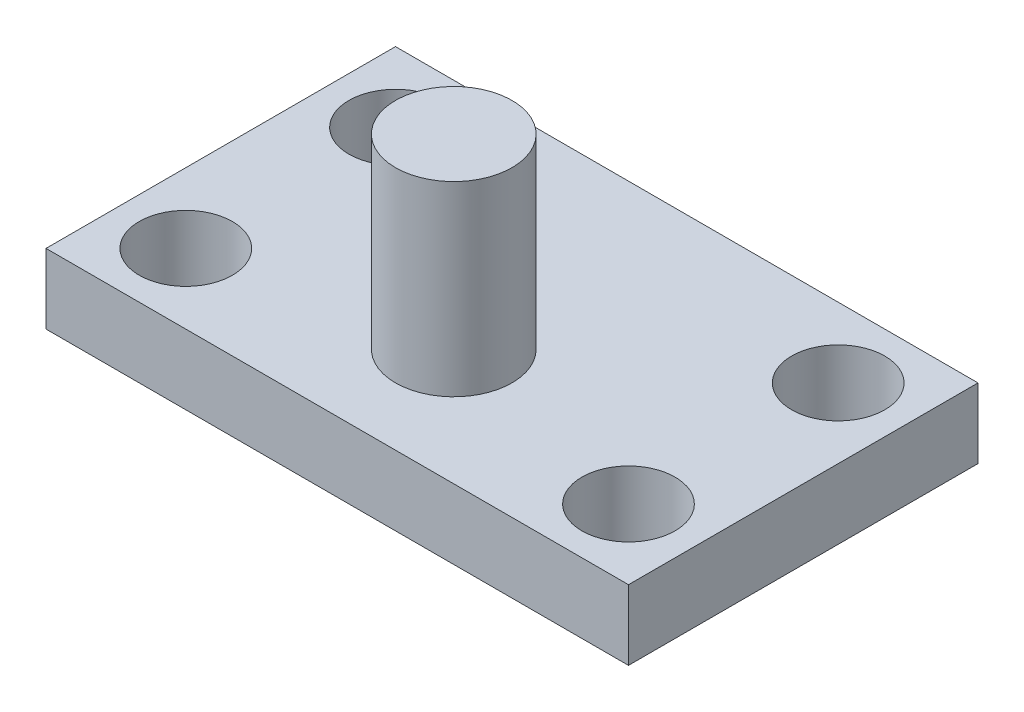
ISO-10303-21;
HEADER;
FILE_DESCRIPTION(('STEP AP214'),'2;1');
FILE_NAME('part.step','',(''),(''),'','','');
FILE_SCHEMA(('AUTOMOTIVE_DESIGN { 1 0 10303 214 1 1 1 1 }'));
ENDSEC;
DATA;
#1=APPLICATION_CONTEXT('core data for automotive mechanical design processes');
#2=APPLICATION_PROTOCOL_DEFINITION('international standard','automotive_design',2000,#1);
#3=PRODUCT_CONTEXT('',#1,'mechanical');
#4=PRODUCT('Part','Part','',(#3));
#5=PRODUCT_RELATED_PRODUCT_CATEGORY('part','',(#4));
#6=PRODUCT_DEFINITION_FORMATION('','',#4);
#7=PRODUCT_DEFINITION_CONTEXT('part definition',#1,'design');
#8=PRODUCT_DEFINITION('design','',#6,#7);
#9=PRODUCT_DEFINITION_SHAPE('','',#8);
#10=(LENGTH_UNIT() NAMED_UNIT(*) SI_UNIT(.MILLI.,.METRE.));
#11=(NAMED_UNIT(*) PLANE_ANGLE_UNIT() SI_UNIT($,.RADIAN.));
#12=(NAMED_UNIT(*) SI_UNIT($,.STERADIAN.) SOLID_ANGLE_UNIT());
#13=UNCERTAINTY_MEASURE_WITH_UNIT(LENGTH_MEASURE(1.E-05),#10,'distance_accuracy_value','');
#14=(GEOMETRIC_REPRESENTATION_CONTEXT(3) GLOBAL_UNCERTAINTY_ASSIGNED_CONTEXT((#13)) GLOBAL_UNIT_ASSIGNED_CONTEXT((#10,
#11,#12)) REPRESENTATION_CONTEXT('',''));
#15=CARTESIAN_POINT('',(0.,0.,0.));
#16=DIRECTION('',(0.,0.,1.));
#17=DIRECTION('',(1.,0.,0.));
#18=AXIS2_PLACEMENT_3D('',#15,#16,#17);
#19=CARTESIAN_POINT('',(0.,30.,0.));
#20=DIRECTION('',(0.,1.,0.));
#21=DIRECTION('',(0.,0.,1.));
#22=AXIS2_PLACEMENT_3D('',#19,#20,#21);
#23=PLANE('',#22);
#24=CARTESIAN_POINT('',(0.,30.,25.));
#25=DIRECTION('',(0.,1.,0.));
#26=DIRECTION('',(0.,0.,1.));
#27=AXIS2_PLACEMENT_3D('',#24,#25,#26);
#28=CIRCLE('',#27,25.);
#29=CARTESIAN_POINT('',(0.,30.,50.));
#30=VERTEX_POINT('',#29);
#31=EDGE_CURVE('E140',#30,#30,#28,.T.);
#32=ORIENTED_EDGE('',*,*,#31,.F.);
#33=EDGE_LOOP('',(#32));
#34=FACE_BOUND('',#33,.T.);
#35=CARTESIAN_POINT('',(95.,30.,45.));
#36=DIRECTION('',(0.,1.,0.));
#37=DIRECTION('',(0.,0.,1.));
#38=AXIS2_PLACEMENT_3D('',#35,#36,#37);
#39=CIRCLE('',#38,20.);
#40=CARTESIAN_POINT('',(95.,30.,65.));
#41=VERTEX_POINT('',#40);
#42=EDGE_CURVE('E125',#41,#41,#39,.T.);
#43=ORIENTED_EDGE('',*,*,#42,.F.);
#44=EDGE_LOOP('',(#43));
#45=FACE_BOUND('',#44,.T.);
#46=CARTESIAN_POINT('',(-95.,30.,-45.));
#47=DIRECTION('',(0.,1.,0.));
#48=DIRECTION('',(0.,0.,1.));
#49=AXIS2_PLACEMENT_3D('',#46,#47,#48);
#50=CIRCLE('',#49,20.);
#51=CARTESIAN_POINT('',(-95.,30.,-25.));
#52=VERTEX_POINT('',#51);
#53=EDGE_CURVE('E104',#52,#52,#50,.T.);
#54=ORIENTED_EDGE('',*,*,#53,.F.);
#55=EDGE_LOOP('',(#54));
#56=FACE_BOUND('',#55,.T.);
#57=DIRECTION('',(0.,0.,-1.));
#58=VECTOR('',#57,1.);
#59=CARTESIAN_POINT('',(125.,30.,-75.));
#60=LINE('',#59,#58);
#61=CARTESIAN_POINT('',(125.,30.,75.));
#62=VERTEX_POINT('',#61);
#63=CARTESIAN_POINT('',(125.,30.,-75.));
#64=VERTEX_POINT('',#63);
#65=EDGE_CURVE('E89',#62,#64,#60,.T.);
#66=ORIENTED_EDGE('',*,*,#65,.T.);
#67=DIRECTION('',(-1.,0.,0.));
#68=VECTOR('',#67,1.);
#69=CARTESIAN_POINT('',(-125.,30.,-75.));
#70=LINE('',#69,#68);
#71=CARTESIAN_POINT('',(-125.,30.,-75.));
#72=VERTEX_POINT('',#71);
#73=EDGE_CURVE('E84',#64,#72,#70,.T.);
#74=ORIENTED_EDGE('',*,*,#73,.T.);
#75=DIRECTION('',(0.,0.,1.));
#76=VECTOR('',#75,1.);
#77=CARTESIAN_POINT('',(-125.,30.,-75.));
#78=LINE('',#77,#76);
#79=CARTESIAN_POINT('',(-125.,30.,75.));
#80=VERTEX_POINT('',#79);
#81=EDGE_CURVE('E87',#72,#80,#78,.T.);
#82=ORIENTED_EDGE('',*,*,#81,.T.);
#83=DIRECTION('',(1.,0.,0.));
#84=VECTOR('',#83,1.);
#85=CARTESIAN_POINT('',(-125.,30.,75.));
#86=LINE('',#85,#84);
#87=EDGE_CURVE('E54',#80,#62,#86,.T.);
#88=ORIENTED_EDGE('',*,*,#87,.T.);
#89=EDGE_LOOP('',(#66,#74,#82,#88));
#90=FACE_BOUND('',#89,.T.);
#91=CARTESIAN_POINT('',(-95.,30.,45.));
#92=DIRECTION('',(0.,1.,0.));
#93=DIRECTION('',(0.,0.,-1.));
#94=AXIS2_PLACEMENT_3D('',#91,#92,#93);
#95=CIRCLE('',#94,20.);
#96=CARTESIAN_POINT('',(-95.,30.,25.));
#97=VERTEX_POINT('',#96);
#98=EDGE_CURVE('E119',#97,#97,#95,.T.);
#99=ORIENTED_EDGE('',*,*,#98,.F.);
#100=EDGE_LOOP('',(#99));
#101=FACE_BOUND('',#100,.T.);
#102=CARTESIAN_POINT('',(95.,30.,-45.));
#103=DIRECTION('',(0.,1.,0.));
#104=DIRECTION('',(0.,0.,-1.));
#105=AXIS2_PLACEMENT_3D('',#102,#103,#104);
#106=CIRCLE('',#105,20.);
#107=CARTESIAN_POINT('',(95.,30.,-65.));
#108=VERTEX_POINT('',#107);
#109=EDGE_CURVE('E131',#108,#108,#106,.T.);
#110=ORIENTED_EDGE('',*,*,#109,.F.);
#111=EDGE_LOOP('',(#110));
#112=FACE_BOUND('',#111,.T.);
#113=ADVANCED_FACE('F37',(#34,#45,#56,#90,#101,#112),#23,.T.);
#114=CARTESIAN_POINT('',(0.,0.,0.));
#115=DIRECTION('',(0.,1.,0.));
#116=DIRECTION('',(0.,0.,1.));
#117=AXIS2_PLACEMENT_3D('',#114,#115,#116);
#118=PLANE('',#117);
#119=DIRECTION('',(0.,0.,-1.));
#120=VECTOR('',#119,1.);
#121=CARTESIAN_POINT('',(125.,0.,-75.));
#122=LINE('',#121,#120);
#123=CARTESIAN_POINT('',(125.,0.,75.));
#124=VERTEX_POINT('',#123);
#125=CARTESIAN_POINT('',(125.,0.,-75.));
#126=VERTEX_POINT('',#125);
#127=EDGE_CURVE('E101',#124,#126,#122,.T.);
#128=ORIENTED_EDGE('',*,*,#127,.F.);
#129=DIRECTION('',(1.,0.,0.));
#130=VECTOR('',#129,1.);
#131=CARTESIAN_POINT('',(-125.,0.,75.));
#132=LINE('',#131,#130);
#133=CARTESIAN_POINT('',(-125.,0.,75.));
#134=VERTEX_POINT('',#133);
#135=EDGE_CURVE('E77',#134,#124,#132,.T.);
#136=ORIENTED_EDGE('',*,*,#135,.F.);
#137=DIRECTION('',(0.,0.,1.));
#138=VECTOR('',#137,1.);
#139=CARTESIAN_POINT('',(-125.,0.,-75.));
#140=LINE('',#139,#138);
#141=CARTESIAN_POINT('',(-125.,0.,-75.));
#142=VERTEX_POINT('',#141);
#143=EDGE_CURVE('E71',#142,#134,#140,.T.);
#144=ORIENTED_EDGE('',*,*,#143,.F.);
#145=DIRECTION('',(-1.,0.,0.));
#146=VECTOR('',#145,1.);
#147=CARTESIAN_POINT('',(-125.,0.,-75.));
#148=LINE('',#147,#146);
#149=EDGE_CURVE('E93',#126,#142,#148,.T.);
#150=ORIENTED_EDGE('',*,*,#149,.F.);
#151=EDGE_LOOP('',(#128,#136,#144,#150));
#152=FACE_BOUND('',#151,.T.);
#153=CARTESIAN_POINT('',(-95.,0.,-45.));
#154=DIRECTION('',(0.,1.,0.));
#155=DIRECTION('',(0.,0.,1.));
#156=AXIS2_PLACEMENT_3D('',#153,#154,#155);
#157=CIRCLE('',#156,20.);
#158=CARTESIAN_POINT('',(-95.,0.,-25.));
#159=VERTEX_POINT('',#158);
#160=EDGE_CURVE('E116',#159,#159,#157,.T.);
#161=ORIENTED_EDGE('',*,*,#160,.T.);
#162=EDGE_LOOP('',(#161));
#163=FACE_BOUND('',#162,.T.);
#164=CARTESIAN_POINT('',(-95.,0.,45.));
#165=DIRECTION('',(0.,1.,0.));
#166=DIRECTION('',(0.,0.,-1.));
#167=AXIS2_PLACEMENT_3D('',#164,#165,#166);
#168=CIRCLE('',#167,20.);
#169=CARTESIAN_POINT('',(-95.,0.,25.));
#170=VERTEX_POINT('',#169);
#171=EDGE_CURVE('E122',#170,#170,#168,.T.);
#172=ORIENTED_EDGE('',*,*,#171,.T.);
#173=EDGE_LOOP('',(#172));
#174=FACE_BOUND('',#173,.T.);
#175=CARTESIAN_POINT('',(95.,0.,45.));
#176=DIRECTION('',(0.,1.,0.));
#177=DIRECTION('',(0.,0.,1.));
#178=AXIS2_PLACEMENT_3D('',#175,#176,#177);
#179=CIRCLE('',#178,20.);
#180=CARTESIAN_POINT('',(95.,0.,65.));
#181=VERTEX_POINT('',#180);
#182=EDGE_CURVE('E128',#181,#181,#179,.T.);
#183=ORIENTED_EDGE('',*,*,#182,.T.);
#184=EDGE_LOOP('',(#183));
#185=FACE_BOUND('',#184,.T.);
#186=CARTESIAN_POINT('',(95.,0.,-45.));
#187=DIRECTION('',(0.,1.,0.));
#188=DIRECTION('',(0.,0.,-1.));
#189=AXIS2_PLACEMENT_3D('',#186,#187,#188);
#190=CIRCLE('',#189,20.);
#191=CARTESIAN_POINT('',(95.,0.,-65.));
#192=VERTEX_POINT('',#191);
#193=EDGE_CURVE('E134',#192,#192,#190,.T.);
#194=ORIENTED_EDGE('',*,*,#193,.T.);
#195=EDGE_LOOP('',(#194));
#196=FACE_BOUND('',#195,.T.);
#197=ADVANCED_FACE('F112',(#152,#163,#174,#185,#196),#118,.F.);
#198=CARTESIAN_POINT('',(125.,30.,-75.));
#199=DIRECTION('',(-1.,0.,0.));
#200=DIRECTION('',(0.,0.,1.));
#201=AXIS2_PLACEMENT_3D('',#198,#199,#200);
#202=PLANE('',#201);
#203=ORIENTED_EDGE('',*,*,#127,.T.);
#204=DIRECTION('',(0.,-1.,0.));
#205=VECTOR('',#204,1.);
#206=CARTESIAN_POINT('',(125.,30.,-75.));
#207=LINE('',#206,#205);
#208=EDGE_CURVE('E11',#64,#126,#207,.T.);
#209=ORIENTED_EDGE('',*,*,#208,.F.);
#210=ORIENTED_EDGE('',*,*,#65,.F.);
#211=DIRECTION('',(0.,-1.,0.));
#212=VECTOR('',#211,1.);
#213=CARTESIAN_POINT('',(125.,30.,75.));
#214=LINE('',#213,#212);
#215=EDGE_CURVE('E97',#62,#124,#214,.T.);
#216=ORIENTED_EDGE('',*,*,#215,.T.);
#217=EDGE_LOOP('',(#203,#209,#210,#216));
#218=FACE_BOUND('',#217,.T.);
#219=ADVANCED_FACE('F39',(#218),#202,.F.);
#220=CARTESIAN_POINT('',(-125.,30.,-75.));
#221=DIRECTION('',(0.,0.,1.));
#222=DIRECTION('',(1.,0.,0.));
#223=AXIS2_PLACEMENT_3D('',#220,#221,#222);
#224=PLANE('',#223);
#225=ORIENTED_EDGE('',*,*,#149,.T.);
#226=DIRECTION('',(0.,-1.,0.));
#227=VECTOR('',#226,1.);
#228=CARTESIAN_POINT('',(-125.,30.,-75.));
#229=LINE('',#228,#227);
#230=EDGE_CURVE('E46',#72,#142,#229,.T.);
#231=ORIENTED_EDGE('',*,*,#230,.F.);
#232=ORIENTED_EDGE('',*,*,#73,.F.);
#233=ORIENTED_EDGE('',*,*,#208,.T.);
#234=EDGE_LOOP('',(#225,#231,#232,#233));
#235=FACE_BOUND('',#234,.T.);
#236=ADVANCED_FACE('F92',(#235),#224,.F.);
#237=CARTESIAN_POINT('',(-125.,30.,-75.));
#238=DIRECTION('',(1.,0.,0.));
#239=DIRECTION('',(0.,0.,-1.));
#240=AXIS2_PLACEMENT_3D('',#237,#238,#239);
#241=PLANE('',#240);
#242=ORIENTED_EDGE('',*,*,#143,.T.);
#243=DIRECTION('',(0.,-1.,0.));
#244=VECTOR('',#243,1.);
#245=CARTESIAN_POINT('',(-125.,30.,75.));
#246=LINE('',#245,#244);
#247=EDGE_CURVE('E94',#80,#134,#246,.T.);
#248=ORIENTED_EDGE('',*,*,#247,.F.);
#249=ORIENTED_EDGE('',*,*,#81,.F.);
#250=ORIENTED_EDGE('',*,*,#230,.T.);
#251=EDGE_LOOP('',(#242,#248,#249,#250));
#252=FACE_BOUND('',#251,.T.);
#253=ADVANCED_FACE('F95',(#252),#241,.F.);
#254=CARTESIAN_POINT('',(-125.,30.,75.));
#255=DIRECTION('',(0.,0.,-1.));
#256=DIRECTION('',(-1.,0.,0.));
#257=AXIS2_PLACEMENT_3D('',#254,#255,#256);
#258=PLANE('',#257);
#259=ORIENTED_EDGE('',*,*,#135,.T.);
#260=ORIENTED_EDGE('',*,*,#215,.F.);
#261=ORIENTED_EDGE('',*,*,#87,.F.);
#262=ORIENTED_EDGE('',*,*,#247,.T.);
#263=EDGE_LOOP('',(#259,#260,#261,#262));
#264=FACE_BOUND('',#263,.T.);
#265=ADVANCED_FACE('F109',(#264),#258,.F.);
#266=CARTESIAN_POINT('',(-95.,30.,-45.));
#267=DIRECTION('',(0.,-1.,0.));
#268=DIRECTION('',(0.,0.,-1.));
#269=AXIS2_PLACEMENT_3D('',#266,#267,#268);
#270=CYLINDRICAL_SURFACE('',#269,20.);
#271=ORIENTED_EDGE('',*,*,#53,.T.);
#272=EDGE_LOOP('',(#271));
#273=FACE_BOUND('',#272,.T.);
#274=ORIENTED_EDGE('',*,*,#160,.F.);
#275=EDGE_LOOP('',(#274));
#276=FACE_BOUND('',#275,.T.);
#277=ADVANCED_FACE('F162',(#273,#276),#270,.F.);
#278=CARTESIAN_POINT('',(-95.,30.,45.));
#279=DIRECTION('',(0.,-1.,0.));
#280=DIRECTION('',(0.,0.,-1.));
#281=AXIS2_PLACEMENT_3D('',#278,#279,#280);
#282=CYLINDRICAL_SURFACE('',#281,20.);
#283=ORIENTED_EDGE('',*,*,#98,.T.);
#284=EDGE_LOOP('',(#283));
#285=FACE_BOUND('',#284,.T.);
#286=ORIENTED_EDGE('',*,*,#171,.F.);
#287=EDGE_LOOP('',(#286));
#288=FACE_BOUND('',#287,.T.);
#289=ADVANCED_FACE('F165',(#285,#288),#282,.F.);
#290=CARTESIAN_POINT('',(95.,30.,45.));
#291=DIRECTION('',(0.,-1.,0.));
#292=DIRECTION('',(0.,0.,-1.));
#293=AXIS2_PLACEMENT_3D('',#290,#291,#292);
#294=CYLINDRICAL_SURFACE('',#293,20.);
#295=ORIENTED_EDGE('',*,*,#42,.T.);
#296=EDGE_LOOP('',(#295));
#297=FACE_BOUND('',#296,.T.);
#298=ORIENTED_EDGE('',*,*,#182,.F.);
#299=EDGE_LOOP('',(#298));
#300=FACE_BOUND('',#299,.T.);
#301=ADVANCED_FACE('F178',(#297,#300),#294,.F.);
#302=CARTESIAN_POINT('',(95.,30.,-45.));
#303=DIRECTION('',(0.,-1.,0.));
#304=DIRECTION('',(0.,0.,-1.));
#305=AXIS2_PLACEMENT_3D('',#302,#303,#304);
#306=CYLINDRICAL_SURFACE('',#305,20.);
#307=ORIENTED_EDGE('',*,*,#109,.T.);
#308=EDGE_LOOP('',(#307));
#309=FACE_BOUND('',#308,.T.);
#310=ORIENTED_EDGE('',*,*,#193,.F.);
#311=EDGE_LOOP('',(#310));
#312=FACE_BOUND('',#311,.T.);
#313=ADVANCED_FACE('F151',(#309,#312),#306,.F.);
#314=CARTESIAN_POINT('',(0.,110.,25.));
#315=DIRECTION('',(0.,-1.,0.));
#316=DIRECTION('',(0.,0.,-1.));
#317=AXIS2_PLACEMENT_3D('',#314,#315,#316);
#318=CYLINDRICAL_SURFACE('',#317,25.);
#319=CARTESIAN_POINT('',(0.,110.,25.));
#320=DIRECTION('',(0.,1.,0.));
#321=DIRECTION('',(0.,0.,1.));
#322=AXIS2_PLACEMENT_3D('',#319,#320,#321);
#323=CIRCLE('',#322,25.);
#324=CARTESIAN_POINT('',(0.,110.,50.));
#325=VERTEX_POINT('',#324);
#326=EDGE_CURVE('E137',#325,#325,#323,.T.);
#327=ORIENTED_EDGE('',*,*,#326,.F.);
#328=EDGE_LOOP('',(#327));
#329=FACE_BOUND('',#328,.T.);
#330=ORIENTED_EDGE('',*,*,#31,.T.);
#331=EDGE_LOOP('',(#330));
#332=FACE_BOUND('',#331,.T.);
#333=ADVANCED_FACE('F148',(#329,#332),#318,.T.);
#334=CARTESIAN_POINT('',(0.,110.,25.));
#335=DIRECTION('',(0.,1.,0.));
#336=DIRECTION('',(0.,0.,1.));
#337=AXIS2_PLACEMENT_3D('',#334,#335,#336);
#338=PLANE('',#337);
#339=ORIENTED_EDGE('',*,*,#326,.T.);
#340=EDGE_LOOP('',(#339));
#341=FACE_BOUND('',#340,.T.);
#342=ADVANCED_FACE('F146',(#341),#338,.T.);
#343=CLOSED_SHELL('',(#113,#197,#219,#236,#253,#265,#277,#289,#301,#313,#333,#342));
#344=MANIFOLD_SOLID_BREP('B2',#343);
#345=ADVANCED_BREP_SHAPE_REPRESENTATION('',(#18,#344),#14);
#346=SHAPE_DEFINITION_REPRESENTATION(#9,#345);
ENDSEC;
END-ISO-10303-21;
